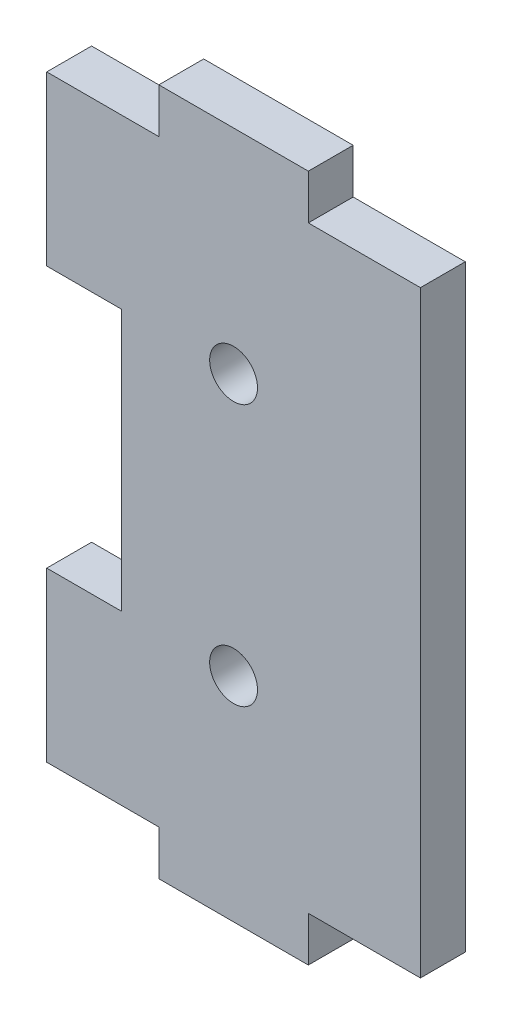
ISO-10303-21;
HEADER;
FILE_DESCRIPTION(('STEP AP214'),'2;1');
FILE_NAME('part.step','',(''),(''),'','','');
FILE_SCHEMA(('AUTOMOTIVE_DESIGN { 1 0 10303 214 1 1 1 1 }'));
ENDSEC;
DATA;
#1=APPLICATION_CONTEXT('core data for automotive mechanical design processes');
#2=APPLICATION_PROTOCOL_DEFINITION('international standard','automotive_design',2000,#1);
#3=PRODUCT_CONTEXT('',#1,'mechanical');
#4=PRODUCT('Part','Part','',(#3));
#5=PRODUCT_RELATED_PRODUCT_CATEGORY('part','',(#4));
#6=PRODUCT_DEFINITION_FORMATION('','',#4);
#7=PRODUCT_DEFINITION_CONTEXT('part definition',#1,'design');
#8=PRODUCT_DEFINITION('design','',#6,#7);
#9=PRODUCT_DEFINITION_SHAPE('','',#8);
#10=(LENGTH_UNIT() NAMED_UNIT(*) SI_UNIT(.MILLI.,.METRE.));
#11=(NAMED_UNIT(*) PLANE_ANGLE_UNIT() SI_UNIT($,.RADIAN.));
#12=(NAMED_UNIT(*) SI_UNIT($,.STERADIAN.) SOLID_ANGLE_UNIT());
#13=UNCERTAINTY_MEASURE_WITH_UNIT(LENGTH_MEASURE(1.E-05),#10,'distance_accuracy_value','');
#14=(GEOMETRIC_REPRESENTATION_CONTEXT(3) GLOBAL_UNCERTAINTY_ASSIGNED_CONTEXT((#13)) GLOBAL_UNIT_ASSIGNED_CONTEXT((#10,
#11,#12)) REPRESENTATION_CONTEXT('',''));
#15=CARTESIAN_POINT('',(0.,0.,0.));
#16=DIRECTION('',(0.,0.,1.));
#17=DIRECTION('',(1.,0.,0.));
#18=AXIS2_PLACEMENT_3D('',#15,#16,#17);
#19=CARTESIAN_POINT('',(0.,0.,3.));
#20=DIRECTION('',(0.,0.,-1.));
#21=DIRECTION('',(-1.,0.,0.));
#22=AXIS2_PLACEMENT_3D('',#19,#20,#21);
#23=PLANE('',#22);
#24=DIRECTION('',(0.,1.,0.));
#25=VECTOR('',#24,1.);
#26=CARTESIAN_POINT('',(5.,20.,3.));
#27=LINE('',#26,#25);
#28=CARTESIAN_POINT('',(5.,20.,3.));
#29=VERTEX_POINT('',#28);
#30=CARTESIAN_POINT('',(5.,23.,3.));
#31=VERTEX_POINT('',#30);
#32=EDGE_CURVE('E209',#29,#31,#27,.T.);
#33=ORIENTED_EDGE('',*,*,#32,.T.);
#34=DIRECTION('',(-1.,0.,0.));
#35=VECTOR('',#34,1.);
#36=CARTESIAN_POINT('',(-5.,23.,3.));
#37=LINE('',#36,#35);
#38=CARTESIAN_POINT('',(-5.,23.,3.));
#39=VERTEX_POINT('',#38);
#40=EDGE_CURVE('E117',#31,#39,#37,.T.);
#41=ORIENTED_EDGE('',*,*,#40,.T.);
#42=DIRECTION('',(0.,-1.,0.));
#43=VECTOR('',#42,1.);
#44=CARTESIAN_POINT('',(-5.,20.,3.));
#45=LINE('',#44,#43);
#46=CARTESIAN_POINT('',(-5.,20.,3.));
#47=VERTEX_POINT('',#46);
#48=EDGE_CURVE('E248',#39,#47,#45,.T.);
#49=ORIENTED_EDGE('',*,*,#48,.T.);
#50=DIRECTION('',(-1.,0.,0.));
#51=VECTOR('',#50,1.);
#52=CARTESIAN_POINT('',(-12.5,20.,3.));
#53=LINE('',#52,#51);
#54=CARTESIAN_POINT('',(-12.5,20.,3.));
#55=VERTEX_POINT('',#54);
#56=EDGE_CURVE('E267',#47,#55,#53,.T.);
#57=ORIENTED_EDGE('',*,*,#56,.T.);
#58=DIRECTION('',(0.,-1.,0.));
#59=VECTOR('',#58,1.);
#60=CARTESIAN_POINT('',(-12.5,20.,3.));
#61=LINE('',#60,#59);
#62=CARTESIAN_POINT('',(-12.5,8.75,3.));
#63=VERTEX_POINT('',#62);
#64=EDGE_CURVE('E264',#55,#63,#61,.T.);
#65=ORIENTED_EDGE('',*,*,#64,.T.);
#66=DIRECTION('',(1.,0.,0.));
#67=VECTOR('',#66,1.);
#68=CARTESIAN_POINT('',(-12.5,8.75,3.));
#69=LINE('',#68,#67);
#70=CARTESIAN_POINT('',(-7.5,8.75,3.));
#71=VERTEX_POINT('',#70);
#72=EDGE_CURVE('E266',#63,#71,#69,.T.);
#73=ORIENTED_EDGE('',*,*,#72,.T.);
#74=DIRECTION('',(0.,-1.,0.));
#75=VECTOR('',#74,1.);
#76=CARTESIAN_POINT('',(-7.5,8.75,3.));
#77=LINE('',#76,#75);
#78=CARTESIAN_POINT('',(-7.5,-8.75,3.));
#79=VERTEX_POINT('',#78);
#80=EDGE_CURVE('E269',#71,#79,#77,.T.);
#81=ORIENTED_EDGE('',*,*,#80,.T.);
#82=DIRECTION('',(-1.,0.,0.));
#83=VECTOR('',#82,1.);
#84=CARTESIAN_POINT('',(-7.5,-8.75,3.));
#85=LINE('',#84,#83);
#86=CARTESIAN_POINT('',(-12.5,-8.75,3.));
#87=VERTEX_POINT('',#86);
#88=EDGE_CURVE('E275',#79,#87,#85,.T.);
#89=ORIENTED_EDGE('',*,*,#88,.T.);
#90=DIRECTION('',(0.,-1.,0.));
#91=VECTOR('',#90,1.);
#92=CARTESIAN_POINT('',(-12.5,-8.75,3.));
#93=LINE('',#92,#91);
#94=CARTESIAN_POINT('',(-12.5,-20.,3.));
#95=VERTEX_POINT('',#94);
#96=EDGE_CURVE('E277',#87,#95,#93,.T.);
#97=ORIENTED_EDGE('',*,*,#96,.T.);
#98=DIRECTION('',(1.,0.,0.));
#99=VECTOR('',#98,1.);
#100=CARTESIAN_POINT('',(-12.5,-20.,3.));
#101=LINE('',#100,#99);
#102=CARTESIAN_POINT('',(-5.,-20.,3.));
#103=VERTEX_POINT('',#102);
#104=EDGE_CURVE('E279',#95,#103,#101,.T.);
#105=ORIENTED_EDGE('',*,*,#104,.T.);
#106=DIRECTION('',(0.,-1.,0.));
#107=VECTOR('',#106,1.);
#108=CARTESIAN_POINT('',(-5.,-23.,3.));
#109=LINE('',#108,#107);
#110=CARTESIAN_POINT('',(-5.,-23.,3.));
#111=VERTEX_POINT('',#110);
#112=EDGE_CURVE('E281',#103,#111,#109,.T.);
#113=ORIENTED_EDGE('',*,*,#112,.T.);
#114=DIRECTION('',(1.,0.,0.));
#115=VECTOR('',#114,1.);
#116=CARTESIAN_POINT('',(-5.,-23.,3.));
#117=LINE('',#116,#115);
#118=CARTESIAN_POINT('',(5.,-23.,3.));
#119=VERTEX_POINT('',#118);
#120=EDGE_CURVE('E283',#111,#119,#117,.T.);
#121=ORIENTED_EDGE('',*,*,#120,.T.);
#122=DIRECTION('',(0.,1.,0.));
#123=VECTOR('',#122,1.);
#124=CARTESIAN_POINT('',(5.,-23.,3.));
#125=LINE('',#124,#123);
#126=CARTESIAN_POINT('',(5.,-20.,3.));
#127=VERTEX_POINT('',#126);
#128=EDGE_CURVE('E160',#119,#127,#125,.T.);
#129=ORIENTED_EDGE('',*,*,#128,.T.);
#130=DIRECTION('',(1.,0.,0.));
#131=VECTOR('',#130,1.);
#132=CARTESIAN_POINT('',(5.,-20.,3.));
#133=LINE('',#132,#131);
#134=CARTESIAN_POINT('',(12.5,-20.,3.));
#135=VERTEX_POINT('',#134);
#136=EDGE_CURVE('E154',#127,#135,#133,.T.);
#137=ORIENTED_EDGE('',*,*,#136,.T.);
#138=DIRECTION('',(0.,1.,0.));
#139=VECTOR('',#138,1.);
#140=CARTESIAN_POINT('',(12.5,20.,3.));
#141=LINE('',#140,#139);
#142=CARTESIAN_POINT('',(12.5,20.,3.));
#143=VERTEX_POINT('',#142);
#144=EDGE_CURVE('E158',#135,#143,#141,.T.);
#145=ORIENTED_EDGE('',*,*,#144,.T.);
#146=DIRECTION('',(-1.,0.,0.));
#147=VECTOR('',#146,1.);
#148=CARTESIAN_POINT('',(5.,20.,3.));
#149=LINE('',#148,#147);
#150=EDGE_CURVE('E50',#143,#29,#149,.T.);
#151=ORIENTED_EDGE('',*,*,#150,.T.);
#152=EDGE_LOOP('',(#33,#41,#49,#57,#65,#73,#81,#89,#97,#105,#113,#121,#129,#137,#145,#151));
#153=FACE_BOUND('',#152,.T.);
#154=CARTESIAN_POINT('',(0.,-8.75,3.));
#155=DIRECTION('',(0.,0.,1.));
#156=DIRECTION('',(1.,0.,0.));
#157=AXIS2_PLACEMENT_3D('',#154,#155,#156);
#158=CIRCLE('',#157,1.6);
#159=CARTESIAN_POINT('',(1.6,-8.75,3.));
#160=VERTEX_POINT('',#159);
#161=EDGE_CURVE('E182',#160,#160,#158,.T.);
#162=ORIENTED_EDGE('',*,*,#161,.F.);
#163=EDGE_LOOP('',(#162));
#164=FACE_BOUND('',#163,.T.);
#165=CARTESIAN_POINT('',(0.,8.75,3.));
#166=DIRECTION('',(0.,0.,1.));
#167=DIRECTION('',(1.,0.,0.));
#168=AXIS2_PLACEMENT_3D('',#165,#166,#167);
#169=CIRCLE('',#168,1.6);
#170=CARTESIAN_POINT('',(1.6,8.75,3.));
#171=VERTEX_POINT('',#170);
#172=EDGE_CURVE('E324',#171,#171,#169,.T.);
#173=ORIENTED_EDGE('',*,*,#172,.F.);
#174=EDGE_LOOP('',(#173));
#175=FACE_BOUND('',#174,.T.);
#176=ADVANCED_FACE('F33',(#153,#164,#175),#23,.F.);
#177=CARTESIAN_POINT('',(0.,0.,0.));
#178=DIRECTION('',(0.,0.,-1.));
#179=DIRECTION('',(-1.,0.,0.));
#180=AXIS2_PLACEMENT_3D('',#177,#178,#179);
#181=PLANE('',#180);
#182=CARTESIAN_POINT('',(0.,-8.75,0.));
#183=DIRECTION('',(0.,0.,1.));
#184=DIRECTION('',(1.,0.,0.));
#185=AXIS2_PLACEMENT_3D('',#182,#183,#184);
#186=CIRCLE('',#185,1.6);
#187=CARTESIAN_POINT('',(1.6,-8.75,0.));
#188=VERTEX_POINT('',#187);
#189=EDGE_CURVE('E329',#188,#188,#186,.T.);
#190=ORIENTED_EDGE('',*,*,#189,.T.);
#191=EDGE_LOOP('',(#190));
#192=FACE_BOUND('',#191,.T.);
#193=DIRECTION('',(0.,1.,0.));
#194=VECTOR('',#193,1.);
#195=CARTESIAN_POINT('',(5.,20.,0.));
#196=LINE('',#195,#194);
#197=CARTESIAN_POINT('',(5.,20.,0.));
#198=VERTEX_POINT('',#197);
#199=CARTESIAN_POINT('',(5.,23.,0.));
#200=VERTEX_POINT('',#199);
#201=EDGE_CURVE('E178',#198,#200,#196,.T.);
#202=ORIENTED_EDGE('',*,*,#201,.F.);
#203=DIRECTION('',(-1.,0.,0.));
#204=VECTOR('',#203,1.);
#205=CARTESIAN_POINT('',(5.,20.,0.));
#206=LINE('',#205,#204);
#207=CARTESIAN_POINT('',(12.5,20.,0.));
#208=VERTEX_POINT('',#207);
#209=EDGE_CURVE('E109',#208,#198,#206,.T.);
#210=ORIENTED_EDGE('',*,*,#209,.F.);
#211=DIRECTION('',(0.,1.,0.));
#212=VECTOR('',#211,1.);
#213=CARTESIAN_POINT('',(12.5,20.,0.));
#214=LINE('',#213,#212);
#215=CARTESIAN_POINT('',(12.5,-20.,0.));
#216=VERTEX_POINT('',#215);
#217=EDGE_CURVE('E103',#216,#208,#214,.T.);
#218=ORIENTED_EDGE('',*,*,#217,.F.);
#219=DIRECTION('',(1.,0.,0.));
#220=VECTOR('',#219,1.);
#221=CARTESIAN_POINT('',(5.,-20.,0.));
#222=LINE('',#221,#220);
#223=CARTESIAN_POINT('',(5.,-20.,0.));
#224=VERTEX_POINT('',#223);
#225=EDGE_CURVE('E168',#224,#216,#222,.T.);
#226=ORIENTED_EDGE('',*,*,#225,.F.);
#227=DIRECTION('',(0.,1.,0.));
#228=VECTOR('',#227,1.);
#229=CARTESIAN_POINT('',(5.,-23.,0.));
#230=LINE('',#229,#228);
#231=CARTESIAN_POINT('',(5.,-23.,0.));
#232=VERTEX_POINT('',#231);
#233=EDGE_CURVE('E204',#232,#224,#230,.T.);
#234=ORIENTED_EDGE('',*,*,#233,.F.);
#235=DIRECTION('',(1.,0.,0.));
#236=VECTOR('',#235,1.);
#237=CARTESIAN_POINT('',(-5.,-23.,0.));
#238=LINE('',#237,#236);
#239=CARTESIAN_POINT('',(-5.,-23.,0.));
#240=VERTEX_POINT('',#239);
#241=EDGE_CURVE('E202',#240,#232,#238,.T.);
#242=ORIENTED_EDGE('',*,*,#241,.F.);
#243=DIRECTION('',(0.,-1.,0.));
#244=VECTOR('',#243,1.);
#245=CARTESIAN_POINT('',(-5.,-23.,0.));
#246=LINE('',#245,#244);
#247=CARTESIAN_POINT('',(-5.,-20.,0.));
#248=VERTEX_POINT('',#247);
#249=EDGE_CURVE('E200',#248,#240,#246,.T.);
#250=ORIENTED_EDGE('',*,*,#249,.F.);
#251=DIRECTION('',(1.,0.,0.));
#252=VECTOR('',#251,1.);
#253=CARTESIAN_POINT('',(-12.5,-20.,0.));
#254=LINE('',#253,#252);
#255=CARTESIAN_POINT('',(-12.5,-20.,0.));
#256=VERTEX_POINT('',#255);
#257=EDGE_CURVE('E198',#256,#248,#254,.T.);
#258=ORIENTED_EDGE('',*,*,#257,.F.);
#259=DIRECTION('',(0.,-1.,0.));
#260=VECTOR('',#259,1.);
#261=CARTESIAN_POINT('',(-12.5,-8.75,0.));
#262=LINE('',#261,#260);
#263=CARTESIAN_POINT('',(-12.5,-8.75,0.));
#264=VERTEX_POINT('',#263);
#265=EDGE_CURVE('E196',#264,#256,#262,.T.);
#266=ORIENTED_EDGE('',*,*,#265,.F.);
#267=DIRECTION('',(-1.,0.,0.));
#268=VECTOR('',#267,1.);
#269=CARTESIAN_POINT('',(-7.5,-8.75,0.));
#270=LINE('',#269,#268);
#271=CARTESIAN_POINT('',(-7.5,-8.75,0.));
#272=VERTEX_POINT('',#271);
#273=EDGE_CURVE('E194',#272,#264,#270,.T.);
#274=ORIENTED_EDGE('',*,*,#273,.F.);
#275=DIRECTION('',(0.,-1.,0.));
#276=VECTOR('',#275,1.);
#277=CARTESIAN_POINT('',(-7.5,8.75,0.));
#278=LINE('',#277,#276);
#279=CARTESIAN_POINT('',(-7.5,8.75,0.));
#280=VERTEX_POINT('',#279);
#281=EDGE_CURVE('E192',#280,#272,#278,.T.);
#282=ORIENTED_EDGE('',*,*,#281,.F.);
#283=DIRECTION('',(1.,0.,0.));
#284=VECTOR('',#283,1.);
#285=CARTESIAN_POINT('',(-12.5,8.75,0.));
#286=LINE('',#285,#284);
#287=CARTESIAN_POINT('',(-12.5,8.75,0.));
#288=VERTEX_POINT('',#287);
#289=EDGE_CURVE('E190',#288,#280,#286,.T.);
#290=ORIENTED_EDGE('',*,*,#289,.F.);
#291=DIRECTION('',(0.,-1.,0.));
#292=VECTOR('',#291,1.);
#293=CARTESIAN_POINT('',(-12.5,20.,0.));
#294=LINE('',#293,#292);
#295=CARTESIAN_POINT('',(-12.5,20.,0.));
#296=VERTEX_POINT('',#295);
#297=EDGE_CURVE('E188',#296,#288,#294,.T.);
#298=ORIENTED_EDGE('',*,*,#297,.F.);
#299=DIRECTION('',(-1.,0.,0.));
#300=VECTOR('',#299,1.);
#301=CARTESIAN_POINT('',(-12.5,20.,0.));
#302=LINE('',#301,#300);
#303=CARTESIAN_POINT('',(-5.,20.,0.));
#304=VERTEX_POINT('',#303);
#305=EDGE_CURVE('E186',#304,#296,#302,.T.);
#306=ORIENTED_EDGE('',*,*,#305,.F.);
#307=DIRECTION('',(0.,-1.,0.));
#308=VECTOR('',#307,1.);
#309=CARTESIAN_POINT('',(-5.,20.,0.));
#310=LINE('',#309,#308);
#311=CARTESIAN_POINT('',(-5.,23.,0.));
#312=VERTEX_POINT('',#311);
#313=EDGE_CURVE('E184',#312,#304,#310,.T.);
#314=ORIENTED_EDGE('',*,*,#313,.F.);
#315=DIRECTION('',(-1.,0.,0.));
#316=VECTOR('',#315,1.);
#317=CARTESIAN_POINT('',(-5.,23.,0.));
#318=LINE('',#317,#316);
#319=EDGE_CURVE('E181',#200,#312,#318,.T.);
#320=ORIENTED_EDGE('',*,*,#319,.F.);
#321=EDGE_LOOP('',(#202,#210,#218,#226,#234,#242,#250,#258,#266,#274,#282,#290,#298,#306,#314,#320));
#322=FACE_BOUND('',#321,.T.);
#323=CARTESIAN_POINT('',(0.,8.75,0.));
#324=DIRECTION('',(0.,0.,1.));
#325=DIRECTION('',(1.,0.,0.));
#326=AXIS2_PLACEMENT_3D('',#323,#324,#325);
#327=CIRCLE('',#326,1.6);
#328=CARTESIAN_POINT('',(1.6,8.75,0.));
#329=VERTEX_POINT('',#328);
#330=EDGE_CURVE('E327',#329,#329,#327,.T.);
#331=ORIENTED_EDGE('',*,*,#330,.T.);
#332=EDGE_LOOP('',(#331));
#333=FACE_BOUND('',#332,.T.);
#334=ADVANCED_FACE('F252',(#192,#322,#333),#181,.T.);
#335=CARTESIAN_POINT('',(5.,20.,3.));
#336=DIRECTION('',(-1.,0.,0.));
#337=DIRECTION('',(0.,0.,1.));
#338=AXIS2_PLACEMENT_3D('',#335,#336,#337);
#339=PLANE('',#338);
#340=ORIENTED_EDGE('',*,*,#201,.T.);
#341=DIRECTION('',(0.,0.,-1.));
#342=VECTOR('',#341,1.);
#343=CARTESIAN_POINT('',(5.,23.,3.));
#344=LINE('',#343,#342);
#345=EDGE_CURVE('E11',#31,#200,#344,.T.);
#346=ORIENTED_EDGE('',*,*,#345,.F.);
#347=ORIENTED_EDGE('',*,*,#32,.F.);
#348=DIRECTION('',(0.,0.,-1.));
#349=VECTOR('',#348,1.);
#350=CARTESIAN_POINT('',(5.,20.,3.));
#351=LINE('',#350,#349);
#352=EDGE_CURVE('E174',#29,#198,#351,.T.);
#353=ORIENTED_EDGE('',*,*,#352,.T.);
#354=EDGE_LOOP('',(#340,#346,#347,#353));
#355=FACE_BOUND('',#354,.T.);
#356=ADVANCED_FACE('F35',(#355),#339,.F.);
#357=CARTESIAN_POINT('',(-5.,23.,3.));
#358=DIRECTION('',(0.,-1.,0.));
#359=DIRECTION('',(0.,0.,-1.));
#360=AXIS2_PLACEMENT_3D('',#357,#358,#359);
#361=PLANE('',#360);
#362=ORIENTED_EDGE('',*,*,#319,.T.);
#363=DIRECTION('',(0.,0.,-1.));
#364=VECTOR('',#363,1.);
#365=CARTESIAN_POINT('',(-5.,23.,3.));
#366=LINE('',#365,#364);
#367=EDGE_CURVE('E42',#39,#312,#366,.T.);
#368=ORIENTED_EDGE('',*,*,#367,.F.);
#369=ORIENTED_EDGE('',*,*,#40,.F.);
#370=ORIENTED_EDGE('',*,*,#345,.T.);
#371=EDGE_LOOP('',(#362,#368,#369,#370));
#372=FACE_BOUND('',#371,.T.);
#373=ADVANCED_FACE('F464',(#372),#361,.F.);
#374=CARTESIAN_POINT('',(-5.,20.,3.));
#375=DIRECTION('',(1.,0.,0.));
#376=DIRECTION('',(0.,0.,-1.));
#377=AXIS2_PLACEMENT_3D('',#374,#375,#376);
#378=PLANE('',#377);
#379=ORIENTED_EDGE('',*,*,#313,.T.);
#380=DIRECTION('',(0.,0.,-1.));
#381=VECTOR('',#380,1.);
#382=CARTESIAN_POINT('',(-5.,20.,3.));
#383=LINE('',#382,#381);
#384=EDGE_CURVE('E240',#47,#304,#383,.T.);
#385=ORIENTED_EDGE('',*,*,#384,.F.);
#386=ORIENTED_EDGE('',*,*,#48,.F.);
#387=ORIENTED_EDGE('',*,*,#367,.T.);
#388=EDGE_LOOP('',(#379,#385,#386,#387));
#389=FACE_BOUND('',#388,.T.);
#390=ADVANCED_FACE('F246',(#389),#378,.F.);
#391=CARTESIAN_POINT('',(-12.5,20.,3.));
#392=DIRECTION('',(0.,-1.,0.));
#393=DIRECTION('',(1.,0.,0.));
#394=AXIS2_PLACEMENT_3D('',#391,#392,#393);
#395=PLANE('',#394);
#396=ORIENTED_EDGE('',*,*,#305,.T.);
#397=DIRECTION('',(0.,0.,-1.));
#398=VECTOR('',#397,1.);
#399=CARTESIAN_POINT('',(-12.5,20.,3.));
#400=LINE('',#399,#398);
#401=EDGE_CURVE('E237',#55,#296,#400,.T.);
#402=ORIENTED_EDGE('',*,*,#401,.F.);
#403=ORIENTED_EDGE('',*,*,#56,.F.);
#404=ORIENTED_EDGE('',*,*,#384,.T.);
#405=EDGE_LOOP('',(#396,#402,#403,#404));
#406=FACE_BOUND('',#405,.T.);
#407=ADVANCED_FACE('F258',(#406),#395,.F.);
#408=CARTESIAN_POINT('',(-12.5,20.,3.));
#409=DIRECTION('',(1.,0.,0.));
#410=DIRECTION('',(0.,0.,-1.));
#411=AXIS2_PLACEMENT_3D('',#408,#409,#410);
#412=PLANE('',#411);
#413=ORIENTED_EDGE('',*,*,#297,.T.);
#414=DIRECTION('',(0.,0.,-1.));
#415=VECTOR('',#414,1.);
#416=CARTESIAN_POINT('',(-12.5,8.75,3.));
#417=LINE('',#416,#415);
#418=EDGE_CURVE('E234',#63,#288,#417,.T.);
#419=ORIENTED_EDGE('',*,*,#418,.F.);
#420=ORIENTED_EDGE('',*,*,#64,.F.);
#421=ORIENTED_EDGE('',*,*,#401,.T.);
#422=EDGE_LOOP('',(#413,#419,#420,#421));
#423=FACE_BOUND('',#422,.T.);
#424=ADVANCED_FACE('F262',(#423),#412,.F.);
#425=CARTESIAN_POINT('',(-12.5,8.75,3.));
#426=DIRECTION('',(0.,1.,0.));
#427=DIRECTION('',(0.,0.,1.));
#428=AXIS2_PLACEMENT_3D('',#425,#426,#427);
#429=PLANE('',#428);
#430=ORIENTED_EDGE('',*,*,#289,.T.);
#431=DIRECTION('',(0.,0.,-1.));
#432=VECTOR('',#431,1.);
#433=CARTESIAN_POINT('',(-7.5,8.75,3.));
#434=LINE('',#433,#432);
#435=EDGE_CURVE('E231',#71,#280,#434,.T.);
#436=ORIENTED_EDGE('',*,*,#435,.F.);
#437=ORIENTED_EDGE('',*,*,#72,.F.);
#438=ORIENTED_EDGE('',*,*,#418,.T.);
#439=EDGE_LOOP('',(#430,#436,#437,#438));
#440=FACE_BOUND('',#439,.T.);
#441=ADVANCED_FACE('F429',(#440),#429,.F.);
#442=CARTESIAN_POINT('',(-7.5,8.75,3.));
#443=DIRECTION('',(1.,0.,0.));
#444=DIRECTION('',(0.,1.,0.));
#445=AXIS2_PLACEMENT_3D('',#442,#443,#444);
#446=PLANE('',#445);
#447=ORIENTED_EDGE('',*,*,#281,.T.);
#448=DIRECTION('',(0.,0.,-1.));
#449=VECTOR('',#448,1.);
#450=CARTESIAN_POINT('',(-7.5,-8.75,3.));
#451=LINE('',#450,#449);
#452=EDGE_CURVE('E228',#79,#272,#451,.T.);
#453=ORIENTED_EDGE('',*,*,#452,.F.);
#454=ORIENTED_EDGE('',*,*,#80,.F.);
#455=ORIENTED_EDGE('',*,*,#435,.T.);
#456=EDGE_LOOP('',(#447,#453,#454,#455));
#457=FACE_BOUND('',#456,.T.);
#458=ADVANCED_FACE('F419',(#457),#446,.F.);
#459=CARTESIAN_POINT('',(-7.5,-8.75,3.));
#460=DIRECTION('',(0.,-1.,0.));
#461=DIRECTION('',(0.,0.,-1.));
#462=AXIS2_PLACEMENT_3D('',#459,#460,#461);
#463=PLANE('',#462);
#464=ORIENTED_EDGE('',*,*,#273,.T.);
#465=DIRECTION('',(0.,0.,-1.));
#466=VECTOR('',#465,1.);
#467=CARTESIAN_POINT('',(-12.5,-8.75,3.));
#468=LINE('',#467,#466);
#469=EDGE_CURVE('E225',#87,#264,#468,.T.);
#470=ORIENTED_EDGE('',*,*,#469,.F.);
#471=ORIENTED_EDGE('',*,*,#88,.F.);
#472=ORIENTED_EDGE('',*,*,#452,.T.);
#473=EDGE_LOOP('',(#464,#470,#471,#472));
#474=FACE_BOUND('',#473,.T.);
#475=ADVANCED_FACE('F409',(#474),#463,.F.);
#476=CARTESIAN_POINT('',(-12.5,-8.75,3.));
#477=DIRECTION('',(1.,0.,0.));
#478=DIRECTION('',(0.,1.,0.));
#479=AXIS2_PLACEMENT_3D('',#476,#477,#478);
#480=PLANE('',#479);
#481=ORIENTED_EDGE('',*,*,#265,.T.);
#482=DIRECTION('',(0.,0.,-1.));
#483=VECTOR('',#482,1.);
#484=CARTESIAN_POINT('',(-12.5,-20.,3.));
#485=LINE('',#484,#483);
#486=EDGE_CURVE('E222',#95,#256,#485,.T.);
#487=ORIENTED_EDGE('',*,*,#486,.F.);
#488=ORIENTED_EDGE('',*,*,#96,.F.);
#489=ORIENTED_EDGE('',*,*,#469,.T.);
#490=EDGE_LOOP('',(#481,#487,#488,#489));
#491=FACE_BOUND('',#490,.T.);
#492=ADVANCED_FACE('F399',(#491),#480,.F.);
#493=CARTESIAN_POINT('',(-12.5,-20.,3.));
#494=DIRECTION('',(0.,1.,0.));
#495=DIRECTION('',(-1.,0.,0.));
#496=AXIS2_PLACEMENT_3D('',#493,#494,#495);
#497=PLANE('',#496);
#498=ORIENTED_EDGE('',*,*,#257,.T.);
#499=DIRECTION('',(0.,0.,-1.));
#500=VECTOR('',#499,1.);
#501=CARTESIAN_POINT('',(-5.,-20.,3.));
#502=LINE('',#501,#500);
#503=EDGE_CURVE('E219',#103,#248,#502,.T.);
#504=ORIENTED_EDGE('',*,*,#503,.F.);
#505=ORIENTED_EDGE('',*,*,#104,.F.);
#506=ORIENTED_EDGE('',*,*,#486,.T.);
#507=EDGE_LOOP('',(#498,#504,#505,#506));
#508=FACE_BOUND('',#507,.T.);
#509=ADVANCED_FACE('F389',(#508),#497,.F.);
#510=CARTESIAN_POINT('',(-5.,-23.,3.));
#511=DIRECTION('',(1.,0.,0.));
#512=DIRECTION('',(0.,0.,-1.));
#513=AXIS2_PLACEMENT_3D('',#510,#511,#512);
#514=PLANE('',#513);
#515=ORIENTED_EDGE('',*,*,#249,.T.);
#516=DIRECTION('',(0.,0.,-1.));
#517=VECTOR('',#516,1.);
#518=CARTESIAN_POINT('',(-5.,-23.,3.));
#519=LINE('',#518,#517);
#520=EDGE_CURVE('E216',#111,#240,#519,.T.);
#521=ORIENTED_EDGE('',*,*,#520,.F.);
#522=ORIENTED_EDGE('',*,*,#112,.F.);
#523=ORIENTED_EDGE('',*,*,#503,.T.);
#524=EDGE_LOOP('',(#515,#521,#522,#523));
#525=FACE_BOUND('',#524,.T.);
#526=ADVANCED_FACE('F380',(#525),#514,.F.);
#527=CARTESIAN_POINT('',(-5.,-23.,3.));
#528=DIRECTION('',(0.,1.,0.));
#529=DIRECTION('',(0.,0.,1.));
#530=AXIS2_PLACEMENT_3D('',#527,#528,#529);
#531=PLANE('',#530);
#532=ORIENTED_EDGE('',*,*,#241,.T.);
#533=DIRECTION('',(0.,0.,-1.));
#534=VECTOR('',#533,1.);
#535=CARTESIAN_POINT('',(5.,-23.,3.));
#536=LINE('',#535,#534);
#537=EDGE_CURVE('E213',#119,#232,#536,.T.);
#538=ORIENTED_EDGE('',*,*,#537,.F.);
#539=ORIENTED_EDGE('',*,*,#120,.F.);
#540=ORIENTED_EDGE('',*,*,#520,.T.);
#541=EDGE_LOOP('',(#532,#538,#539,#540));
#542=FACE_BOUND('',#541,.T.);
#543=ADVANCED_FACE('F289',(#542),#531,.F.);
#544=CARTESIAN_POINT('',(5.,-23.,3.));
#545=DIRECTION('',(-1.,0.,0.));
#546=DIRECTION('',(0.,0.,1.));
#547=AXIS2_PLACEMENT_3D('',#544,#545,#546);
#548=PLANE('',#547);
#549=ORIENTED_EDGE('',*,*,#233,.T.);
#550=DIRECTION('',(0.,0.,-1.));
#551=VECTOR('',#550,1.);
#552=CARTESIAN_POINT('',(5.,-20.,3.));
#553=LINE('',#552,#551);
#554=EDGE_CURVE('E169',#127,#224,#553,.T.);
#555=ORIENTED_EDGE('',*,*,#554,.F.);
#556=ORIENTED_EDGE('',*,*,#128,.F.);
#557=ORIENTED_EDGE('',*,*,#537,.T.);
#558=EDGE_LOOP('',(#549,#555,#556,#557));
#559=FACE_BOUND('',#558,.T.);
#560=ADVANCED_FACE('F293',(#559),#548,.F.);
#561=CARTESIAN_POINT('',(5.,-20.,3.));
#562=DIRECTION('',(0.,1.,0.));
#563=DIRECTION('',(0.,0.,1.));
#564=AXIS2_PLACEMENT_3D('',#561,#562,#563);
#565=PLANE('',#564);
#566=ORIENTED_EDGE('',*,*,#225,.T.);
#567=DIRECTION('',(0.,0.,-1.));
#568=VECTOR('',#567,1.);
#569=CARTESIAN_POINT('',(12.5,-20.,3.));
#570=LINE('',#569,#568);
#571=EDGE_CURVE('E165',#135,#216,#570,.T.);
#572=ORIENTED_EDGE('',*,*,#571,.F.);
#573=ORIENTED_EDGE('',*,*,#136,.F.);
#574=ORIENTED_EDGE('',*,*,#554,.T.);
#575=EDGE_LOOP('',(#566,#572,#573,#574));
#576=FACE_BOUND('',#575,.T.);
#577=ADVANCED_FACE('F166',(#576),#565,.F.);
#578=CARTESIAN_POINT('',(12.5,20.,3.));
#579=DIRECTION('',(-1.,0.,0.));
#580=DIRECTION('',(0.,0.,1.));
#581=AXIS2_PLACEMENT_3D('',#578,#579,#580);
#582=PLANE('',#581);
#583=ORIENTED_EDGE('',*,*,#217,.T.);
#584=DIRECTION('',(0.,0.,-1.));
#585=VECTOR('',#584,1.);
#586=CARTESIAN_POINT('',(12.5,20.,3.));
#587=LINE('',#586,#585);
#588=EDGE_CURVE('E170',#143,#208,#587,.T.);
#589=ORIENTED_EDGE('',*,*,#588,.F.);
#590=ORIENTED_EDGE('',*,*,#144,.F.);
#591=ORIENTED_EDGE('',*,*,#571,.T.);
#592=EDGE_LOOP('',(#583,#589,#590,#591));
#593=FACE_BOUND('',#592,.T.);
#594=ADVANCED_FACE('F172',(#593),#582,.F.);
#595=CARTESIAN_POINT('',(5.,20.,3.));
#596=DIRECTION('',(0.,-1.,0.));
#597=DIRECTION('',(0.,0.,-1.));
#598=AXIS2_PLACEMENT_3D('',#595,#596,#597);
#599=PLANE('',#598);
#600=ORIENTED_EDGE('',*,*,#209,.T.);
#601=ORIENTED_EDGE('',*,*,#352,.F.);
#602=ORIENTED_EDGE('',*,*,#150,.F.);
#603=ORIENTED_EDGE('',*,*,#588,.T.);
#604=EDGE_LOOP('',(#600,#601,#602,#603));
#605=FACE_BOUND('',#604,.T.);
#606=ADVANCED_FACE('F297',(#605),#599,.F.);
#607=CARTESIAN_POINT('',(0.,-8.75,3.));
#608=DIRECTION('',(0.,0.,-1.));
#609=DIRECTION('',(-1.,0.,0.));
#610=AXIS2_PLACEMENT_3D('',#607,#608,#609);
#611=CYLINDRICAL_SURFACE('',#610,1.6);
#612=ORIENTED_EDGE('',*,*,#161,.T.);
#613=EDGE_LOOP('',(#612));
#614=FACE_BOUND('',#613,.T.);
#615=ORIENTED_EDGE('',*,*,#189,.F.);
#616=EDGE_LOOP('',(#615));
#617=FACE_BOUND('',#616,.T.);
#618=ADVANCED_FACE('F299',(#614,#617),#611,.F.);
#619=CARTESIAN_POINT('',(0.,8.75,3.));
#620=DIRECTION('',(0.,0.,-1.));
#621=DIRECTION('',(-1.,0.,0.));
#622=AXIS2_PLACEMENT_3D('',#619,#620,#621);
#623=CYLINDRICAL_SURFACE('',#622,1.6);
#624=ORIENTED_EDGE('',*,*,#172,.T.);
#625=EDGE_LOOP('',(#624));
#626=FACE_BOUND('',#625,.T.);
#627=ORIENTED_EDGE('',*,*,#330,.F.);
#628=EDGE_LOOP('',(#627));
#629=FACE_BOUND('',#628,.T.);
#630=ADVANCED_FACE('F305',(#626,#629),#623,.F.);
#631=CLOSED_SHELL('',(#176,#334,#356,#373,#390,#407,#424,#441,#458,#475,#492,#509,#526,#543,
#560,#577,#594,#606,#618,#630));
#632=MANIFOLD_SOLID_BREP('B2',#631);
#633=ADVANCED_BREP_SHAPE_REPRESENTATION('',(#18,#632),#14);
#634=SHAPE_DEFINITION_REPRESENTATION(#9,#633);
ENDSEC;
END-ISO-10303-21;
